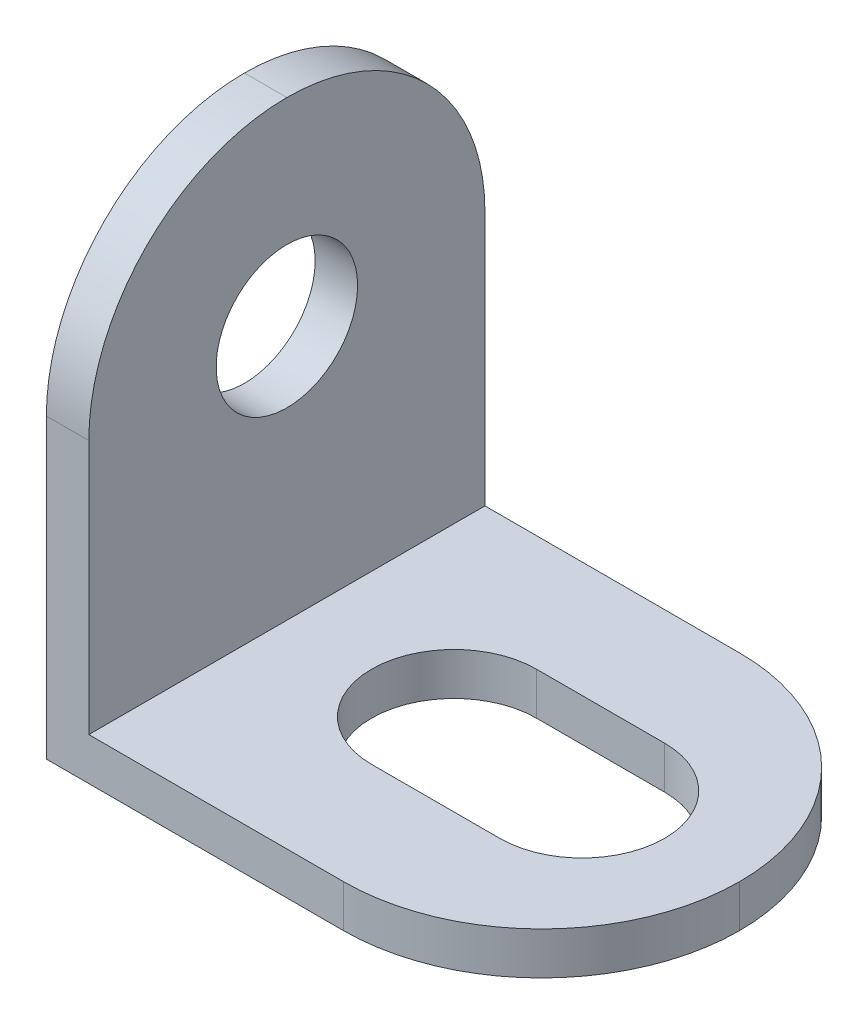
ISO-10303-21;
HEADER;
FILE_DESCRIPTION(('STEP AP214'),'2;1');
FILE_NAME('part.step','',(''),(''),'','','');
FILE_SCHEMA(('AUTOMOTIVE_DESIGN { 1 0 10303 214 1 1 1 1 }'));
ENDSEC;
DATA;
#1=APPLICATION_CONTEXT('core data for automotive mechanical design processes');
#2=APPLICATION_PROTOCOL_DEFINITION('international standard','automotive_design',2000,#1);
#3=PRODUCT_CONTEXT('',#1,'mechanical');
#4=PRODUCT('Part','Part','',(#3));
#5=PRODUCT_RELATED_PRODUCT_CATEGORY('part','',(#4));
#6=PRODUCT_DEFINITION_FORMATION('','',#4);
#7=PRODUCT_DEFINITION_CONTEXT('part definition',#1,'design');
#8=PRODUCT_DEFINITION('design','',#6,#7);
#9=PRODUCT_DEFINITION_SHAPE('','',#8);
#10=(LENGTH_UNIT() NAMED_UNIT(*) SI_UNIT(.MILLI.,.METRE.));
#11=(NAMED_UNIT(*) PLANE_ANGLE_UNIT() SI_UNIT($,.RADIAN.));
#12=(NAMED_UNIT(*) SI_UNIT($,.STERADIAN.) SOLID_ANGLE_UNIT());
#13=UNCERTAINTY_MEASURE_WITH_UNIT(LENGTH_MEASURE(1.E-05),#10,'distance_accuracy_value','');
#14=(GEOMETRIC_REPRESENTATION_CONTEXT(3) GLOBAL_UNCERTAINTY_ASSIGNED_CONTEXT((#13)) GLOBAL_UNIT_ASSIGNED_CONTEXT((#10,
#11,#12)) REPRESENTATION_CONTEXT('',''));
#15=CARTESIAN_POINT('',(0.,0.,0.));
#16=DIRECTION('',(0.,0.,1.));
#17=DIRECTION('',(1.,0.,0.));
#18=AXIS2_PLACEMENT_3D('',#15,#16,#17);
#19=CARTESIAN_POINT('',(0.,-1.5,14.));
#20=DIRECTION('',(0.,1.,0.));
#21=DIRECTION('',(0.,0.,1.));
#22=AXIS2_PLACEMENT_3D('',#19,#20,#21);
#23=PLANE('',#22);
#24=DIRECTION('',(1.,0.,0.));
#25=VECTOR('',#24,1.);
#26=CARTESIAN_POINT('',(5.90692482049349,-1.5,4.08603122015859));
#27=LINE('',#26,#25);
#28=CARTESIAN_POINT('',(5.90692482049349,-1.5,4.08603122015859));
#29=VERTEX_POINT('',#28);
#30=CARTESIAN_POINT('',(10.4366443089958,-1.5,4.08603122015859));
#31=VERTEX_POINT('',#30);
#32=EDGE_CURVE('E132',#29,#31,#27,.T.);
#33=ORIENTED_EDGE('',*,*,#32,.F.);
#34=CARTESIAN_POINT('',(5.90692482049349,-1.5,7.));
#35=DIRECTION('',(0.,1.,0.));
#36=DIRECTION('',(0.,0.,1.));
#37=AXIS2_PLACEMENT_3D('',#34,#35,#36);
#38=CIRCLE('',#37,2.91396877984141);
#39=CARTESIAN_POINT('',(5.90692482049349,-1.5,9.91396877984141));
#40=VERTEX_POINT('',#39);
#41=EDGE_CURVE('E126',#29,#40,#38,.T.);
#42=ORIENTED_EDGE('',*,*,#41,.T.);
#43=DIRECTION('',(1.,0.,0.));
#44=VECTOR('',#43,1.);
#45=CARTESIAN_POINT('',(5.90692482049349,-1.5,9.91396877984141));
#46=LINE('',#45,#44);
#47=CARTESIAN_POINT('',(10.4366443089958,-1.5,9.91396877984141));
#48=VERTEX_POINT('',#47);
#49=EDGE_CURVE('E135',#40,#48,#46,.T.);
#50=ORIENTED_EDGE('',*,*,#49,.T.);
#51=CARTESIAN_POINT('',(10.4366443089958,-1.5,7.));
#52=DIRECTION('',(0.,1.,0.));
#53=DIRECTION('',(0.,0.,1.));
#54=AXIS2_PLACEMENT_3D('',#51,#52,#53);
#55=CIRCLE('',#54,2.91396877984141);
#56=EDGE_CURVE('E50',#48,#31,#55,.T.);
#57=ORIENTED_EDGE('',*,*,#56,.T.);
#58=EDGE_LOOP('',(#33,#42,#50,#57));
#59=FACE_BOUND('',#58,.T.);
#60=CARTESIAN_POINT('',(9.,-1.5,7.));
#61=DIRECTION('',(0.,1.,0.));
#62=DIRECTION('',(0.,0.,1.));
#63=AXIS2_PLACEMENT_3D('',#60,#61,#62);
#64=CIRCLE('',#63,7.);
#65=CARTESIAN_POINT('',(9.,-1.5,0.));
#66=VERTEX_POINT('',#65);
#67=CARTESIAN_POINT('',(16.,-1.5,7.));
#68=VERTEX_POINT('',#67);
#69=EDGE_CURVE('E189',#66,#68,#64,.F.);
#70=ORIENTED_EDGE('',*,*,#69,.T.);
#71=CARTESIAN_POINT('',(9.,-1.5,7.));
#72=DIRECTION('',(0.,1.,0.));
#73=DIRECTION('',(0.,0.,1.));
#74=AXIS2_PLACEMENT_3D('',#71,#72,#73);
#75=CIRCLE('',#74,7.);
#76=CARTESIAN_POINT('',(9.,-1.5,14.));
#77=VERTEX_POINT('',#76);
#78=EDGE_CURVE('E191',#68,#77,#75,.F.);
#79=ORIENTED_EDGE('',*,*,#78,.T.);
#80=DIRECTION('',(1.,0.,0.));
#81=VECTOR('',#80,1.);
#82=CARTESIAN_POINT('',(0.,-1.5,14.));
#83=LINE('',#82,#81);
#84=CARTESIAN_POINT('',(-1.5,-1.5,14.));
#85=VERTEX_POINT('',#84);
#86=EDGE_CURVE('E162',#85,#77,#83,.T.);
#87=ORIENTED_EDGE('',*,*,#86,.F.);
#88=DIRECTION('',(0.,0.,-1.));
#89=VECTOR('',#88,1.);
#90=CARTESIAN_POINT('',(-1.5,-1.5,14.));
#91=LINE('',#90,#89);
#92=CARTESIAN_POINT('',(-1.5,-1.5,0.));
#93=VERTEX_POINT('',#92);
#94=EDGE_CURVE('E173',#85,#93,#91,.T.);
#95=ORIENTED_EDGE('',*,*,#94,.T.);
#96=DIRECTION('',(1.,0.,0.));
#97=VECTOR('',#96,1.);
#98=CARTESIAN_POINT('',(0.,-1.5,0.));
#99=LINE('',#98,#97);
#100=EDGE_CURVE('E174',#93,#66,#99,.T.);
#101=ORIENTED_EDGE('',*,*,#100,.T.);
#102=EDGE_LOOP('',(#70,#79,#87,#95,#101));
#103=FACE_BOUND('',#102,.T.);
#104=ADVANCED_FACE('F33',(#59,#103),#23,.F.);
#105=CARTESIAN_POINT('',(0.,0.,14.));
#106=DIRECTION('',(0.,1.,0.));
#107=DIRECTION('',(0.,0.,1.));
#108=AXIS2_PLACEMENT_3D('',#105,#106,#107);
#109=PLANE('',#108);
#110=CARTESIAN_POINT('',(5.90692482049349,0.,7.));
#111=DIRECTION('',(0.,1.,0.));
#112=DIRECTION('',(0.,0.,1.));
#113=AXIS2_PLACEMENT_3D('',#110,#111,#112);
#114=CIRCLE('',#113,2.91396877984141);
#115=CARTESIAN_POINT('',(5.90692482049349,0.,4.08603122015859));
#116=VERTEX_POINT('',#115);
#117=CARTESIAN_POINT('',(5.90692482049349,0.,9.91396877984141));
#118=VERTEX_POINT('',#117);
#119=EDGE_CURVE('E58',#116,#118,#114,.T.);
#120=ORIENTED_EDGE('',*,*,#119,.F.);
#121=DIRECTION('',(1.,0.,0.));
#122=VECTOR('',#121,1.);
#123=CARTESIAN_POINT('',(5.90692482049349,0.,4.08603122015859));
#124=LINE('',#123,#122);
#125=CARTESIAN_POINT('',(10.4366443089958,0.,4.08603122015859));
#126=VERTEX_POINT('',#125);
#127=EDGE_CURVE('E140',#116,#126,#124,.T.);
#128=ORIENTED_EDGE('',*,*,#127,.T.);
#129=CARTESIAN_POINT('',(10.4366443089958,0.,7.));
#130=DIRECTION('',(0.,1.,0.));
#131=DIRECTION('',(0.,0.,1.));
#132=AXIS2_PLACEMENT_3D('',#129,#130,#131);
#133=CIRCLE('',#132,2.91396877984141);
#134=CARTESIAN_POINT('',(10.4366443089958,0.,9.91396877984141));
#135=VERTEX_POINT('',#134);
#136=EDGE_CURVE('E143',#135,#126,#133,.T.);
#137=ORIENTED_EDGE('',*,*,#136,.F.);
#138=DIRECTION('',(1.,0.,0.));
#139=VECTOR('',#138,1.);
#140=CARTESIAN_POINT('',(5.90692482049349,0.,9.91396877984141));
#141=LINE('',#140,#139);
#142=EDGE_CURVE('E152',#118,#135,#141,.T.);
#143=ORIENTED_EDGE('',*,*,#142,.F.);
#144=EDGE_LOOP('',(#120,#128,#137,#143));
#145=FACE_BOUND('',#144,.T.);
#146=DIRECTION('',(1.,0.,0.));
#147=VECTOR('',#146,1.);
#148=CARTESIAN_POINT('',(0.,0.,14.));
#149=LINE('',#148,#147);
#150=CARTESIAN_POINT('',(0.,0.,14.));
#151=VERTEX_POINT('',#150);
#152=CARTESIAN_POINT('',(9.,0.,14.));
#153=VERTEX_POINT('',#152);
#154=EDGE_CURVE('E165',#151,#153,#149,.T.);
#155=ORIENTED_EDGE('',*,*,#154,.T.);
#156=CARTESIAN_POINT('',(9.,0.,7.));
#157=DIRECTION('',(0.,1.,0.));
#158=DIRECTION('',(0.,0.,1.));
#159=AXIS2_PLACEMENT_3D('',#156,#157,#158);
#160=CIRCLE('',#159,7.);
#161=CARTESIAN_POINT('',(16.,0.,7.));
#162=VERTEX_POINT('',#161);
#163=EDGE_CURVE('E200',#153,#162,#160,.T.);
#164=ORIENTED_EDGE('',*,*,#163,.T.);
#165=CARTESIAN_POINT('',(9.,0.,7.));
#166=DIRECTION('',(0.,1.,0.));
#167=DIRECTION('',(0.,0.,1.));
#168=AXIS2_PLACEMENT_3D('',#165,#166,#167);
#169=CIRCLE('',#168,7.);
#170=CARTESIAN_POINT('',(9.,0.,0.));
#171=VERTEX_POINT('',#170);
#172=EDGE_CURVE('E198',#162,#171,#169,.T.);
#173=ORIENTED_EDGE('',*,*,#172,.T.);
#174=DIRECTION('',(1.,0.,0.));
#175=VECTOR('',#174,1.);
#176=CARTESIAN_POINT('',(0.,0.,0.));
#177=LINE('',#176,#175);
#178=CARTESIAN_POINT('',(0.,0.,0.));
#179=VERTEX_POINT('',#178);
#180=EDGE_CURVE('E177',#179,#171,#177,.T.);
#181=ORIENTED_EDGE('',*,*,#180,.F.);
#182=DIRECTION('',(0.,0.,-1.));
#183=VECTOR('',#182,1.);
#184=CARTESIAN_POINT('',(0.,0.,14.));
#185=LINE('',#184,#183);
#186=EDGE_CURVE('E186',#151,#179,#185,.T.);
#187=ORIENTED_EDGE('',*,*,#186,.F.);
#188=EDGE_LOOP('',(#155,#164,#173,#181,#187));
#189=FACE_BOUND('',#188,.T.);
#190=ADVANCED_FACE('F236',(#145,#189),#109,.T.);
#191=CARTESIAN_POINT('',(0.,0.,14.));
#192=DIRECTION('',(1.,0.,0.));
#193=DIRECTION('',(0.,0.,-1.));
#194=AXIS2_PLACEMENT_3D('',#191,#192,#193);
#195=PLANE('',#194);
#196=CARTESIAN_POINT('',(0.,9.,7.));
#197=DIRECTION('',(1.,0.,0.));
#198=DIRECTION('',(0.,0.,-1.));
#199=AXIS2_PLACEMENT_3D('',#196,#197,#198);
#200=CIRCLE('',#199,2.5);
#201=CARTESIAN_POINT('',(0.,9.,4.5));
#202=VERTEX_POINT('',#201);
#203=EDGE_CURVE('E146',#202,#202,#200,.T.);
#204=ORIENTED_EDGE('',*,*,#203,.F.);
#205=EDGE_LOOP('',(#204));
#206=FACE_BOUND('',#205,.T.);
#207=DIRECTION('',(0.,-1.,0.));
#208=VECTOR('',#207,1.);
#209=CARTESIAN_POINT('',(0.,0.,0.));
#210=LINE('',#209,#208);
#211=CARTESIAN_POINT('',(0.,9.,0.));
#212=VERTEX_POINT('',#211);
#213=EDGE_CURVE('E181',#212,#179,#210,.T.);
#214=ORIENTED_EDGE('',*,*,#213,.F.);
#215=CARTESIAN_POINT('',(0.,9.,7.));
#216=DIRECTION('',(1.,0.,0.));
#217=DIRECTION('',(0.,0.,-1.));
#218=AXIS2_PLACEMENT_3D('',#215,#216,#217);
#219=CIRCLE('',#218,7.);
#220=CARTESIAN_POINT('',(0.,16.,7.));
#221=VERTEX_POINT('',#220);
#222=EDGE_CURVE('E209',#212,#221,#219,.T.);
#223=ORIENTED_EDGE('',*,*,#222,.T.);
#224=CARTESIAN_POINT('',(0.,9.,7.));
#225=DIRECTION('',(1.,0.,0.));
#226=DIRECTION('',(0.,0.,-1.));
#227=AXIS2_PLACEMENT_3D('',#224,#225,#226);
#228=CIRCLE('',#227,7.);
#229=CARTESIAN_POINT('',(0.,9.,14.));
#230=VERTEX_POINT('',#229);
#231=EDGE_CURVE('E207',#221,#230,#228,.T.);
#232=ORIENTED_EDGE('',*,*,#231,.T.);
#233=DIRECTION('',(0.,-1.,0.));
#234=VECTOR('',#233,1.);
#235=CARTESIAN_POINT('',(0.,0.,14.));
#236=LINE('',#235,#234);
#237=EDGE_CURVE('E169',#230,#151,#236,.T.);
#238=ORIENTED_EDGE('',*,*,#237,.T.);
#239=ORIENTED_EDGE('',*,*,#186,.T.);
#240=EDGE_LOOP('',(#214,#223,#232,#238,#239));
#241=FACE_BOUND('',#240,.T.);
#242=ADVANCED_FACE('F228',(#206,#241),#195,.T.);
#243=CARTESIAN_POINT('',(-1.5,0.,14.));
#244=DIRECTION('',(1.,0.,0.));
#245=DIRECTION('',(0.,0.,-1.));
#246=AXIS2_PLACEMENT_3D('',#243,#244,#245);
#247=PLANE('',#246);
#248=CARTESIAN_POINT('',(-1.5,9.,7.));
#249=DIRECTION('',(1.,0.,0.));
#250=DIRECTION('',(0.,0.,-1.));
#251=AXIS2_PLACEMENT_3D('',#248,#249,#250);
#252=CIRCLE('',#251,2.5);
#253=CARTESIAN_POINT('',(-1.5,9.,4.5));
#254=VERTEX_POINT('',#253);
#255=EDGE_CURVE('E153',#254,#254,#252,.T.);
#256=ORIENTED_EDGE('',*,*,#255,.T.);
#257=EDGE_LOOP('',(#256));
#258=FACE_BOUND('',#257,.T.);
#259=CARTESIAN_POINT('',(-1.5,9.,7.));
#260=DIRECTION('',(1.,0.,0.));
#261=DIRECTION('',(0.,0.,-1.));
#262=AXIS2_PLACEMENT_3D('',#259,#260,#261);
#263=CIRCLE('',#262,7.);
#264=CARTESIAN_POINT('',(-1.5,9.,14.));
#265=VERTEX_POINT('',#264);
#266=CARTESIAN_POINT('',(-1.5,16.,7.));
#267=VERTEX_POINT('',#266);
#268=EDGE_CURVE('E42',#265,#267,#263,.F.);
#269=ORIENTED_EDGE('',*,*,#268,.T.);
#270=CARTESIAN_POINT('',(-1.5,9.,7.));
#271=DIRECTION('',(1.,0.,0.));
#272=DIRECTION('',(0.,0.,-1.));
#273=AXIS2_PLACEMENT_3D('',#270,#271,#272);
#274=CIRCLE('',#273,7.);
#275=CARTESIAN_POINT('',(-1.5,9.,0.));
#276=VERTEX_POINT('',#275);
#277=EDGE_CURVE('E11',#267,#276,#274,.F.);
#278=ORIENTED_EDGE('',*,*,#277,.T.);
#279=DIRECTION('',(0.,1.,0.));
#280=VECTOR('',#279,1.);
#281=CARTESIAN_POINT('',(-1.5,0.,0.));
#282=LINE('',#281,#280);
#283=EDGE_CURVE('E166',#276,#93,#282,.F.);
#284=ORIENTED_EDGE('',*,*,#283,.T.);
#285=ORIENTED_EDGE('',*,*,#94,.F.);
#286=DIRECTION('',(0.,1.,0.));
#287=VECTOR('',#286,1.);
#288=CARTESIAN_POINT('',(-1.5,0.,14.));
#289=LINE('',#288,#287);
#290=EDGE_CURVE('E171',#265,#85,#289,.F.);
#291=ORIENTED_EDGE('',*,*,#290,.F.);
#292=EDGE_LOOP('',(#269,#278,#284,#285,#291));
#293=FACE_BOUND('',#292,.T.);
#294=ADVANCED_FACE('F246',(#258,#293),#247,.F.);
#295=CARTESIAN_POINT('',(0.,0.,14.));
#296=DIRECTION('',(0.,0.,-1.));
#297=DIRECTION('',(-1.,0.,0.));
#298=AXIS2_PLACEMENT_3D('',#295,#296,#297);
#299=PLANE('',#298);
#300=ORIENTED_EDGE('',*,*,#86,.T.);
#301=DIRECTION('',(0.,-1.,0.));
#302=VECTOR('',#301,1.);
#303=CARTESIAN_POINT('',(9.,0.,14.));
#304=LINE('',#303,#302);
#305=EDGE_CURVE('E195',#77,#153,#304,.F.);
#306=ORIENTED_EDGE('',*,*,#305,.T.);
#307=ORIENTED_EDGE('',*,*,#154,.F.);
#308=ORIENTED_EDGE('',*,*,#237,.F.);
#309=DIRECTION('',(1.,0.,0.));
#310=VECTOR('',#309,1.);
#311=CARTESIAN_POINT('',(-1.5,9.,14.));
#312=LINE('',#311,#310);
#313=EDGE_CURVE('E193',#230,#265,#312,.F.);
#314=ORIENTED_EDGE('',*,*,#313,.T.);
#315=ORIENTED_EDGE('',*,*,#290,.T.);
#316=EDGE_LOOP('',(#300,#306,#307,#308,#314,#315));
#317=FACE_BOUND('',#316,.T.);
#318=ADVANCED_FACE('F232',(#317),#299,.F.);
#319=CARTESIAN_POINT('',(0.,0.,0.));
#320=DIRECTION('',(0.,0.,-1.));
#321=DIRECTION('',(-1.,0.,0.));
#322=AXIS2_PLACEMENT_3D('',#319,#320,#321);
#323=PLANE('',#322);
#324=ORIENTED_EDGE('',*,*,#180,.T.);
#325=DIRECTION('',(0.,-1.,0.));
#326=VECTOR('',#325,1.);
#327=CARTESIAN_POINT('',(9.,0.,0.));
#328=LINE('',#327,#326);
#329=EDGE_CURVE('E205',#171,#66,#328,.T.);
#330=ORIENTED_EDGE('',*,*,#329,.T.);
#331=ORIENTED_EDGE('',*,*,#100,.F.);
#332=ORIENTED_EDGE('',*,*,#283,.F.);
#333=DIRECTION('',(1.,0.,0.));
#334=VECTOR('',#333,1.);
#335=CARTESIAN_POINT('',(0.,9.,0.));
#336=LINE('',#335,#334);
#337=EDGE_CURVE('E202',#276,#212,#336,.T.);
#338=ORIENTED_EDGE('',*,*,#337,.T.);
#339=ORIENTED_EDGE('',*,*,#213,.T.);
#340=EDGE_LOOP('',(#324,#330,#331,#332,#338,#339));
#341=FACE_BOUND('',#340,.T.);
#342=ADVANCED_FACE('F240',(#341),#323,.T.);
#343=CARTESIAN_POINT('',(9.,0.,7.));
#344=DIRECTION('',(0.,-1.,0.));
#345=DIRECTION('',(0.,0.,-1.));
#346=AXIS2_PLACEMENT_3D('',#343,#344,#345);
#347=CYLINDRICAL_SURFACE('',#346,7.);
#348=ORIENTED_EDGE('',*,*,#329,.F.);
#349=ORIENTED_EDGE('',*,*,#172,.F.);
#350=DIRECTION('',(0.,-1.,0.));
#351=VECTOR('',#350,1.);
#352=CARTESIAN_POINT('',(16.,0.,7.));
#353=LINE('',#352,#351);
#354=EDGE_CURVE('E178',#68,#162,#353,.F.);
#355=ORIENTED_EDGE('',*,*,#354,.F.);
#356=ORIENTED_EDGE('',*,*,#69,.F.);
#357=EDGE_LOOP('',(#348,#349,#355,#356));
#358=FACE_BOUND('',#357,.T.);
#359=ADVANCED_FACE('F251',(#358),#347,.T.);
#360=CARTESIAN_POINT('',(9.,0.,7.));
#361=DIRECTION('',(0.,1.,0.));
#362=DIRECTION('',(0.,0.,1.));
#363=AXIS2_PLACEMENT_3D('',#360,#361,#362);
#364=CYLINDRICAL_SURFACE('',#363,7.);
#365=ORIENTED_EDGE('',*,*,#163,.F.);
#366=ORIENTED_EDGE('',*,*,#305,.F.);
#367=ORIENTED_EDGE('',*,*,#78,.F.);
#368=ORIENTED_EDGE('',*,*,#354,.T.);
#369=EDGE_LOOP('',(#365,#366,#367,#368));
#370=FACE_BOUND('',#369,.T.);
#371=ADVANCED_FACE('F249',(#370),#364,.T.);
#372=CARTESIAN_POINT('',(-1.5,9.,7.));
#373=DIRECTION('',(-1.,0.,0.));
#374=DIRECTION('',(0.,0.,1.));
#375=AXIS2_PLACEMENT_3D('',#372,#373,#374);
#376=CYLINDRICAL_SURFACE('',#375,7.);
#377=DIRECTION('',(1.,0.,0.));
#378=VECTOR('',#377,1.);
#379=CARTESIAN_POINT('',(0.,16.,7.));
#380=LINE('',#379,#378);
#381=EDGE_CURVE('E37',#267,#221,#380,.T.);
#382=ORIENTED_EDGE('',*,*,#381,.F.);
#383=ORIENTED_EDGE('',*,*,#268,.F.);
#384=ORIENTED_EDGE('',*,*,#313,.F.);
#385=ORIENTED_EDGE('',*,*,#231,.F.);
#386=EDGE_LOOP('',(#382,#383,#384,#385));
#387=FACE_BOUND('',#386,.T.);
#388=ADVANCED_FACE('F35',(#387),#376,.T.);
#389=CARTESIAN_POINT('',(0.,9.,7.));
#390=DIRECTION('',(1.,0.,0.));
#391=DIRECTION('',(0.,0.,-1.));
#392=AXIS2_PLACEMENT_3D('',#389,#390,#391);
#393=CYLINDRICAL_SURFACE('',#392,7.);
#394=ORIENTED_EDGE('',*,*,#277,.F.);
#395=ORIENTED_EDGE('',*,*,#381,.T.);
#396=ORIENTED_EDGE('',*,*,#222,.F.);
#397=ORIENTED_EDGE('',*,*,#337,.F.);
#398=EDGE_LOOP('',(#394,#395,#396,#397));
#399=FACE_BOUND('',#398,.T.);
#400=ADVANCED_FACE('F219',(#399),#393,.T.);
#401=CARTESIAN_POINT('',(5.90692482049349,-1.5,7.));
#402=DIRECTION('',(0.,1.,0.));
#403=DIRECTION('',(0.,0.,1.));
#404=AXIS2_PLACEMENT_3D('',#401,#402,#403);
#405=CYLINDRICAL_SURFACE('',#404,2.91396877984141);
#406=ORIENTED_EDGE('',*,*,#119,.T.);
#407=DIRECTION('',(0.,1.,0.));
#408=VECTOR('',#407,1.);
#409=CARTESIAN_POINT('',(5.90692482049349,-1.5,9.91396877984141));
#410=LINE('',#409,#408);
#411=EDGE_CURVE('E122',#40,#118,#410,.T.);
#412=ORIENTED_EDGE('',*,*,#411,.F.);
#413=ORIENTED_EDGE('',*,*,#41,.F.);
#414=DIRECTION('',(0.,1.,0.));
#415=VECTOR('',#414,1.);
#416=CARTESIAN_POINT('',(5.90692482049349,-1.5,4.08603122015859));
#417=LINE('',#416,#415);
#418=EDGE_CURVE('E157',#29,#116,#417,.T.);
#419=ORIENTED_EDGE('',*,*,#418,.T.);
#420=EDGE_LOOP('',(#406,#412,#413,#419));
#421=FACE_BOUND('',#420,.T.);
#422=ADVANCED_FACE('F124',(#421),#405,.F.);
#423=CARTESIAN_POINT('',(5.90692482049349,-1.5,4.08603122015859));
#424=DIRECTION('',(0.,0.,1.));
#425=DIRECTION('',(1.,0.,0.));
#426=AXIS2_PLACEMENT_3D('',#423,#424,#425);
#427=PLANE('',#426);
#428=ORIENTED_EDGE('',*,*,#127,.F.);
#429=ORIENTED_EDGE('',*,*,#418,.F.);
#430=ORIENTED_EDGE('',*,*,#32,.T.);
#431=DIRECTION('',(0.,1.,0.));
#432=VECTOR('',#431,1.);
#433=CARTESIAN_POINT('',(10.4366443089958,-1.5,4.08603122015859));
#434=LINE('',#433,#432);
#435=EDGE_CURVE('E159',#31,#126,#434,.T.);
#436=ORIENTED_EDGE('',*,*,#435,.T.);
#437=EDGE_LOOP('',(#428,#429,#430,#436));
#438=FACE_BOUND('',#437,.T.);
#439=ADVANCED_FACE('F279',(#438),#427,.T.);
#440=CARTESIAN_POINT('',(10.4366443089958,-1.5,7.));
#441=DIRECTION('',(0.,1.,0.));
#442=DIRECTION('',(0.,0.,1.));
#443=AXIS2_PLACEMENT_3D('',#440,#441,#442);
#444=CYLINDRICAL_SURFACE('',#443,2.91396877984141);
#445=ORIENTED_EDGE('',*,*,#136,.T.);
#446=ORIENTED_EDGE('',*,*,#435,.F.);
#447=ORIENTED_EDGE('',*,*,#56,.F.);
#448=DIRECTION('',(0.,1.,0.));
#449=VECTOR('',#448,1.);
#450=CARTESIAN_POINT('',(10.4366443089958,-1.5,9.91396877984141));
#451=LINE('',#450,#449);
#452=EDGE_CURVE('E131',#48,#135,#451,.T.);
#453=ORIENTED_EDGE('',*,*,#452,.T.);
#454=EDGE_LOOP('',(#445,#446,#447,#453));
#455=FACE_BOUND('',#454,.T.);
#456=ADVANCED_FACE('F283',(#455),#444,.F.);
#457=CARTESIAN_POINT('',(5.90692482049349,-1.5,9.91396877984141));
#458=DIRECTION('',(0.,0.,1.));
#459=DIRECTION('',(1.,0.,0.));
#460=AXIS2_PLACEMENT_3D('',#457,#458,#459);
#461=PLANE('',#460);
#462=ORIENTED_EDGE('',*,*,#142,.T.);
#463=ORIENTED_EDGE('',*,*,#452,.F.);
#464=ORIENTED_EDGE('',*,*,#49,.F.);
#465=ORIENTED_EDGE('',*,*,#411,.T.);
#466=EDGE_LOOP('',(#462,#463,#464,#465));
#467=FACE_BOUND('',#466,.T.);
#468=ADVANCED_FACE('F136',(#467),#461,.F.);
#469=CARTESIAN_POINT('',(-1.5,9.,7.));
#470=DIRECTION('',(1.,0.,0.));
#471=DIRECTION('',(0.,0.,-1.));
#472=AXIS2_PLACEMENT_3D('',#469,#470,#471);
#473=CYLINDRICAL_SURFACE('',#472,2.5);
#474=ORIENTED_EDGE('',*,*,#255,.F.);
#475=EDGE_LOOP('',(#474));
#476=FACE_BOUND('',#475,.T.);
#477=ORIENTED_EDGE('',*,*,#203,.T.);
#478=EDGE_LOOP('',(#477));
#479=FACE_BOUND('',#478,.T.);
#480=ADVANCED_FACE('F282',(#476,#479),#473,.F.);
#481=CLOSED_SHELL('',(#104,#190,#242,#294,#318,#342,#359,#371,#388,#400,#422,#439,#456,#468,#480));
#482=MANIFOLD_SOLID_BREP('B2',#481);
#483=ADVANCED_BREP_SHAPE_REPRESENTATION('',(#18,#482),#14);
#484=SHAPE_DEFINITION_REPRESENTATION(#9,#483);
ENDSEC;
END-ISO-10303-21;
